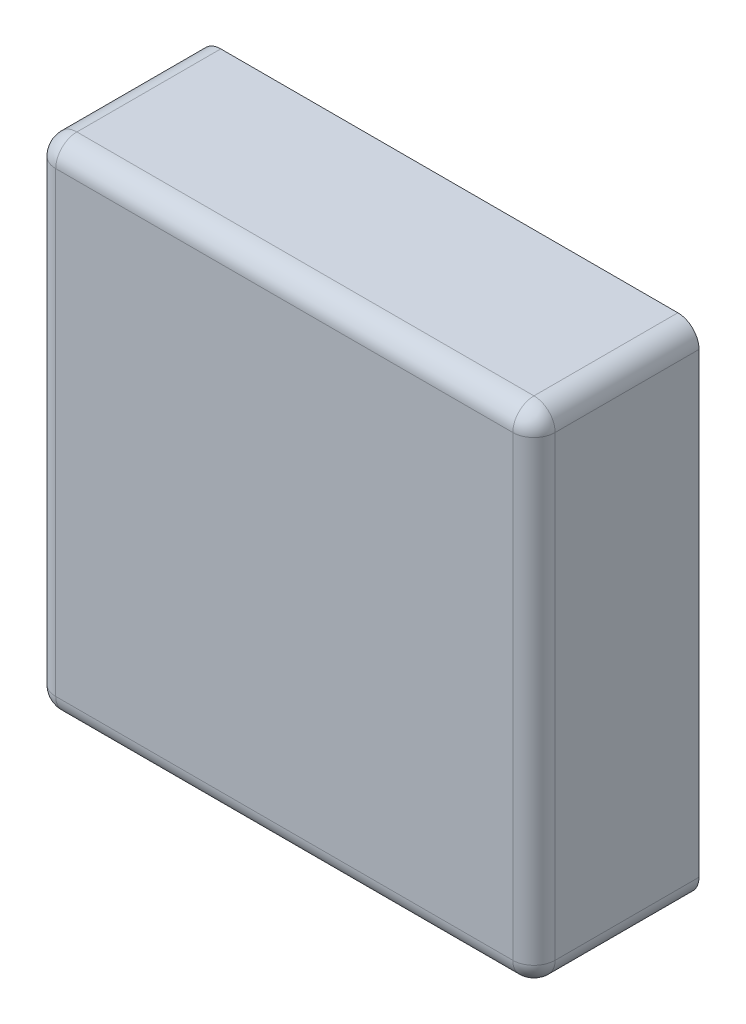
ISO-10303-21;
HEADER;
FILE_DESCRIPTION(('STEP AP214'),'2;1');
FILE_NAME('part.step','',(''),(''),'','','');
FILE_SCHEMA(('AUTOMOTIVE_DESIGN { 1 0 10303 214 1 1 1 1 }'));
ENDSEC;
DATA;
#1=APPLICATION_CONTEXT('core data for automotive mechanical design processes');
#2=APPLICATION_PROTOCOL_DEFINITION('international standard','automotive_design',2000,#1);
#3=PRODUCT_CONTEXT('',#1,'mechanical');
#4=PRODUCT('Part','Part','',(#3));
#5=PRODUCT_RELATED_PRODUCT_CATEGORY('part','',(#4));
#6=PRODUCT_DEFINITION_FORMATION('','',#4);
#7=PRODUCT_DEFINITION_CONTEXT('part definition',#1,'design');
#8=PRODUCT_DEFINITION('design','',#6,#7);
#9=PRODUCT_DEFINITION_SHAPE('','',#8);
#10=(LENGTH_UNIT() NAMED_UNIT(*) SI_UNIT(.MILLI.,.METRE.));
#11=(NAMED_UNIT(*) PLANE_ANGLE_UNIT() SI_UNIT($,.RADIAN.));
#12=(NAMED_UNIT(*) SI_UNIT($,.STERADIAN.) SOLID_ANGLE_UNIT());
#13=UNCERTAINTY_MEASURE_WITH_UNIT(LENGTH_MEASURE(1.E-05),#10,'distance_accuracy_value','');
#14=(GEOMETRIC_REPRESENTATION_CONTEXT(3) GLOBAL_UNCERTAINTY_ASSIGNED_CONTEXT((#13)) GLOBAL_UNIT_ASSIGNED_CONTEXT((#10,
#11,#12)) REPRESENTATION_CONTEXT('',''));
#15=CARTESIAN_POINT('',(0.,0.,0.));
#16=DIRECTION('',(0.,0.,1.));
#17=DIRECTION('',(1.,0.,0.));
#18=AXIS2_PLACEMENT_3D('',#15,#16,#17);
#19=CARTESIAN_POINT('',(5.9,-5.9,3.2));
#20=DIRECTION('',(0.,0.,1.));
#21=DIRECTION('',(1.,0.,0.));
#22=AXIS2_PLACEMENT_3D('',#19,#20,#21);
#23=PLANE('',#22);
#24=DIRECTION('',(0.,1.,0.));
#25=VECTOR('',#24,1.);
#26=CARTESIAN_POINT('',(10.9,-10.9,3.2));
#27=LINE('',#26,#25);
#28=CARTESIAN_POINT('',(10.9,-0.9,3.2));
#29=VERTEX_POINT('',#28);
#30=CARTESIAN_POINT('',(10.9,-10.9,3.2));
#31=VERTEX_POINT('',#30);
#32=EDGE_CURVE('E138',#29,#31,#27,.F.);
#33=ORIENTED_EDGE('',*,*,#32,.T.);
#34=DIRECTION('',(1.,0.,0.));
#35=VECTOR('',#34,1.);
#36=CARTESIAN_POINT('',(0.900000000000001,-10.9,3.2));
#37=LINE('',#36,#35);
#38=CARTESIAN_POINT('',(0.9,-10.9,3.2));
#39=VERTEX_POINT('',#38);
#40=EDGE_CURVE('E135',#31,#39,#37,.F.);
#41=ORIENTED_EDGE('',*,*,#40,.T.);
#42=DIRECTION('',(0.,1.,0.));
#43=VECTOR('',#42,1.);
#44=CARTESIAN_POINT('',(0.9,-0.900000000000001,3.2));
#45=LINE('',#44,#43);
#46=CARTESIAN_POINT('',(0.9,-0.9,3.2));
#47=VERTEX_POINT('',#46);
#48=EDGE_CURVE('E132',#39,#47,#45,.T.);
#49=ORIENTED_EDGE('',*,*,#48,.T.);
#50=DIRECTION('',(1.,0.,0.));
#51=VECTOR('',#50,1.);
#52=CARTESIAN_POINT('',(10.9,-0.9,3.2));
#53=LINE('',#52,#51);
#54=EDGE_CURVE('E155',#47,#29,#53,.T.);
#55=ORIENTED_EDGE('',*,*,#54,.T.);
#56=EDGE_LOOP('',(#33,#41,#49,#55));
#57=FACE_BOUND('',#56,.T.);
#58=ADVANCED_FACE('F17',(#57),#23,.F.);
#59=CARTESIAN_POINT('',(0.900000000000001,-10.9,0.));
#60=DIRECTION('',(0.,-1.,0.));
#61=DIRECTION('',(0.,0.,-1.));
#62=AXIS2_PLACEMENT_3D('',#59,#60,#61);
#63=PLANE('',#62);
#64=DIRECTION('',(0.,0.,1.));
#65=VECTOR('',#64,1.);
#66=CARTESIAN_POINT('',(0.9,-10.9,0.));
#67=LINE('',#66,#65);
#68=CARTESIAN_POINT('',(0.9,-10.9,0.));
#69=VERTEX_POINT('',#68);
#70=EDGE_CURVE('E141',#69,#39,#67,.T.);
#71=ORIENTED_EDGE('',*,*,#70,.T.);
#72=ORIENTED_EDGE('',*,*,#40,.F.);
#73=DIRECTION('',(0.,0.,-1.));
#74=VECTOR('',#73,1.);
#75=CARTESIAN_POINT('',(10.9,-10.9,0.));
#76=LINE('',#75,#74);
#77=CARTESIAN_POINT('',(10.9,-10.9,0.));
#78=VERTEX_POINT('',#77);
#79=EDGE_CURVE('E211',#31,#78,#76,.T.);
#80=ORIENTED_EDGE('',*,*,#79,.T.);
#81=DIRECTION('',(1.,0.,0.));
#82=VECTOR('',#81,1.);
#83=CARTESIAN_POINT('',(5.9,-10.9,0.));
#84=LINE('',#83,#82);
#85=EDGE_CURVE('E146',#78,#69,#84,.F.);
#86=ORIENTED_EDGE('',*,*,#85,.T.);
#87=EDGE_LOOP('',(#71,#72,#80,#86));
#88=FACE_BOUND('',#87,.T.);
#89=ADVANCED_FACE('F144',(#88),#63,.F.);
#90=CARTESIAN_POINT('',(0.9,-0.900000000000001,0.));
#91=DIRECTION('',(-1.,0.,0.));
#92=DIRECTION('',(0.,0.,1.));
#93=AXIS2_PLACEMENT_3D('',#90,#91,#92);
#94=PLANE('',#93);
#95=DIRECTION('',(0.,0.,1.));
#96=VECTOR('',#95,1.);
#97=CARTESIAN_POINT('',(0.9,-0.9,0.));
#98=LINE('',#97,#96);
#99=CARTESIAN_POINT('',(0.9,-0.9,0.));
#100=VERTEX_POINT('',#99);
#101=EDGE_CURVE('E152',#100,#47,#98,.T.);
#102=ORIENTED_EDGE('',*,*,#101,.T.);
#103=ORIENTED_EDGE('',*,*,#48,.F.);
#104=ORIENTED_EDGE('',*,*,#70,.F.);
#105=DIRECTION('',(0.,1.,0.));
#106=VECTOR('',#105,1.);
#107=CARTESIAN_POINT('',(0.9,-5.9,0.));
#108=LINE('',#107,#106);
#109=EDGE_CURVE('E233',#69,#100,#108,.T.);
#110=ORIENTED_EDGE('',*,*,#109,.T.);
#111=EDGE_LOOP('',(#102,#103,#104,#110));
#112=FACE_BOUND('',#111,.T.);
#113=ADVANCED_FACE('F150',(#112),#94,.F.);
#114=CARTESIAN_POINT('',(10.9,-0.9,0.));
#115=DIRECTION('',(0.,1.,0.));
#116=DIRECTION('',(0.,0.,1.));
#117=AXIS2_PLACEMENT_3D('',#114,#115,#116);
#118=PLANE('',#117);
#119=DIRECTION('',(0.,0.,-1.));
#120=VECTOR('',#119,1.);
#121=CARTESIAN_POINT('',(10.9,-0.9,0.));
#122=LINE('',#121,#120);
#123=CARTESIAN_POINT('',(10.9,-0.9,0.));
#124=VERTEX_POINT('',#123);
#125=EDGE_CURVE('E215',#124,#29,#122,.F.);
#126=ORIENTED_EDGE('',*,*,#125,.T.);
#127=ORIENTED_EDGE('',*,*,#54,.F.);
#128=ORIENTED_EDGE('',*,*,#101,.F.);
#129=DIRECTION('',(1.,0.,0.));
#130=VECTOR('',#129,1.);
#131=CARTESIAN_POINT('',(5.9,-0.9,0.));
#132=LINE('',#131,#130);
#133=EDGE_CURVE('E226',#100,#124,#132,.T.);
#134=ORIENTED_EDGE('',*,*,#133,.T.);
#135=EDGE_LOOP('',(#126,#127,#128,#134));
#136=FACE_BOUND('',#135,.T.);
#137=ADVANCED_FACE('F224',(#136),#118,.F.);
#138=CARTESIAN_POINT('',(10.9,-10.9,0.));
#139=DIRECTION('',(1.,0.,0.));
#140=DIRECTION('',(0.,0.,-1.));
#141=AXIS2_PLACEMENT_3D('',#138,#139,#140);
#142=PLANE('',#141);
#143=ORIENTED_EDGE('',*,*,#79,.F.);
#144=ORIENTED_EDGE('',*,*,#32,.F.);
#145=ORIENTED_EDGE('',*,*,#125,.F.);
#146=DIRECTION('',(0.,1.,0.));
#147=VECTOR('',#146,1.);
#148=CARTESIAN_POINT('',(10.9,-5.9,0.));
#149=LINE('',#148,#147);
#150=EDGE_CURVE('E205',#124,#78,#149,.F.);
#151=ORIENTED_EDGE('',*,*,#150,.T.);
#152=EDGE_LOOP('',(#143,#144,#145,#151));
#153=FACE_BOUND('',#152,.T.);
#154=ADVANCED_FACE('F229',(#153),#142,.F.);
#155=CARTESIAN_POINT('',(11.3,-11.3,0.));
#156=DIRECTION('',(0.,0.,1.));
#157=DIRECTION('',(1.,0.,0.));
#158=AXIS2_PLACEMENT_3D('',#155,#156,#157);
#159=CYLINDRICAL_SURFACE('',#158,0.5);
#160=CARTESIAN_POINT('',(11.3,-11.3,0.));
#161=DIRECTION('',(0.,0.,1.));
#162=DIRECTION('',(1.,0.,0.));
#163=AXIS2_PLACEMENT_3D('',#160,#161,#162);
#164=CIRCLE('',#163,0.5);
#165=CARTESIAN_POINT('',(11.3,-11.8,0.));
#166=VERTEX_POINT('',#165);
#167=CARTESIAN_POINT('',(11.8,-11.3,0.));
#168=VERTEX_POINT('',#167);
#169=EDGE_CURVE('E207',#166,#168,#164,.T.);
#170=ORIENTED_EDGE('',*,*,#169,.T.);
#171=DIRECTION('',(0.,0.,-1.));
#172=VECTOR('',#171,1.);
#173=CARTESIAN_POINT('',(11.8,-11.3,0.));
#174=LINE('',#173,#172);
#175=CARTESIAN_POINT('',(11.8,-11.3,3.4));
#176=VERTEX_POINT('',#175);
#177=EDGE_CURVE('E198',#176,#168,#174,.T.);
#178=ORIENTED_EDGE('',*,*,#177,.F.);
#179=CARTESIAN_POINT('',(11.3,-11.3,3.4));
#180=DIRECTION('',(0.,0.,1.));
#181=DIRECTION('',(1.,0.,0.));
#182=AXIS2_PLACEMENT_3D('',#179,#180,#181);
#183=CIRCLE('',#182,0.5);
#184=CARTESIAN_POINT('',(11.3,-11.8,3.4));
#185=VERTEX_POINT('',#184);
#186=EDGE_CURVE('E195',#185,#176,#183,.T.);
#187=ORIENTED_EDGE('',*,*,#186,.F.);
#188=DIRECTION('',(0.,0.,-1.));
#189=VECTOR('',#188,1.);
#190=CARTESIAN_POINT('',(11.3,-11.8,0.));
#191=LINE('',#190,#189);
#192=EDGE_CURVE('E199',#166,#185,#191,.F.);
#193=ORIENTED_EDGE('',*,*,#192,.F.);
#194=EDGE_LOOP('',(#170,#178,#187,#193));
#195=FACE_BOUND('',#194,.T.);
#196=ADVANCED_FACE('F277',(#195),#159,.T.);
#197=CARTESIAN_POINT('',(11.3,-0.5,0.));
#198=DIRECTION('',(0.,0.,1.));
#199=DIRECTION('',(1.,0.,0.));
#200=AXIS2_PLACEMENT_3D('',#197,#198,#199);
#201=CYLINDRICAL_SURFACE('',#200,0.5);
#202=CARTESIAN_POINT('',(11.3,-0.5,0.));
#203=DIRECTION('',(0.,0.,1.));
#204=DIRECTION('',(1.,0.,0.));
#205=AXIS2_PLACEMENT_3D('',#202,#203,#204);
#206=CIRCLE('',#205,0.5);
#207=CARTESIAN_POINT('',(11.8,-0.5,0.));
#208=VERTEX_POINT('',#207);
#209=CARTESIAN_POINT('',(11.3,0.,0.));
#210=VERTEX_POINT('',#209);
#211=EDGE_CURVE('E206',#208,#210,#206,.T.);
#212=ORIENTED_EDGE('',*,*,#211,.T.);
#213=DIRECTION('',(0.,0.,1.));
#214=VECTOR('',#213,1.);
#215=CARTESIAN_POINT('',(11.3,0.,0.));
#216=LINE('',#215,#214);
#217=CARTESIAN_POINT('',(11.3,0.,3.4));
#218=VERTEX_POINT('',#217);
#219=EDGE_CURVE('E193',#218,#210,#216,.F.);
#220=ORIENTED_EDGE('',*,*,#219,.F.);
#221=CARTESIAN_POINT('',(11.3,-0.5,3.4));
#222=DIRECTION('',(0.,0.,1.));
#223=DIRECTION('',(1.,0.,0.));
#224=AXIS2_PLACEMENT_3D('',#221,#222,#223);
#225=CIRCLE('',#224,0.5);
#226=CARTESIAN_POINT('',(11.8,-0.5,3.4));
#227=VERTEX_POINT('',#226);
#228=EDGE_CURVE('E190',#227,#218,#225,.T.);
#229=ORIENTED_EDGE('',*,*,#228,.F.);
#230=DIRECTION('',(0.,0.,-1.));
#231=VECTOR('',#230,1.);
#232=CARTESIAN_POINT('',(11.8,-0.5,0.));
#233=LINE('',#232,#231);
#234=EDGE_CURVE('E194',#208,#227,#233,.F.);
#235=ORIENTED_EDGE('',*,*,#234,.F.);
#236=EDGE_LOOP('',(#212,#220,#229,#235));
#237=FACE_BOUND('',#236,.T.);
#238=ADVANCED_FACE('F274',(#237),#201,.T.);
#239=CARTESIAN_POINT('',(0.5,-0.5,0.));
#240=DIRECTION('',(0.,0.,1.));
#241=DIRECTION('',(1.,0.,0.));
#242=AXIS2_PLACEMENT_3D('',#239,#240,#241);
#243=CYLINDRICAL_SURFACE('',#242,0.5);
#244=CARTESIAN_POINT('',(0.5,-0.5,0.));
#245=DIRECTION('',(0.,0.,1.));
#246=DIRECTION('',(1.,0.,0.));
#247=AXIS2_PLACEMENT_3D('',#244,#245,#246);
#248=CIRCLE('',#247,0.5);
#249=CARTESIAN_POINT('',(0.5,0.,0.));
#250=VERTEX_POINT('',#249);
#251=CARTESIAN_POINT('',(0.,-0.5,0.));
#252=VERTEX_POINT('',#251);
#253=EDGE_CURVE('E20',#250,#252,#248,.T.);
#254=ORIENTED_EDGE('',*,*,#253,.T.);
#255=DIRECTION('',(0.,0.,1.));
#256=VECTOR('',#255,1.);
#257=CARTESIAN_POINT('',(0.,-0.5,0.));
#258=LINE('',#257,#256);
#259=CARTESIAN_POINT('',(0.,-0.5,3.4));
#260=VERTEX_POINT('',#259);
#261=EDGE_CURVE('E188',#260,#252,#258,.F.);
#262=ORIENTED_EDGE('',*,*,#261,.F.);
#263=CARTESIAN_POINT('',(0.5,-0.5,3.4));
#264=DIRECTION('',(0.,0.,1.));
#265=DIRECTION('',(1.,0.,0.));
#266=AXIS2_PLACEMENT_3D('',#263,#264,#265);
#267=CIRCLE('',#266,0.5);
#268=CARTESIAN_POINT('',(0.5,0.,3.4));
#269=VERTEX_POINT('',#268);
#270=EDGE_CURVE('E186',#269,#260,#267,.T.);
#271=ORIENTED_EDGE('',*,*,#270,.F.);
#272=DIRECTION('',(0.,0.,1.));
#273=VECTOR('',#272,1.);
#274=CARTESIAN_POINT('',(0.5,0.,0.));
#275=LINE('',#274,#273);
#276=EDGE_CURVE('E189',#250,#269,#275,.T.);
#277=ORIENTED_EDGE('',*,*,#276,.F.);
#278=EDGE_LOOP('',(#254,#262,#271,#277));
#279=FACE_BOUND('',#278,.T.);
#280=ADVANCED_FACE('F271',(#279),#243,.T.);
#281=CARTESIAN_POINT('',(5.9,-5.9,0.));
#282=DIRECTION('',(0.,0.,1.));
#283=DIRECTION('',(1.,0.,0.));
#284=AXIS2_PLACEMENT_3D('',#281,#282,#283);
#285=PLANE('',#284);
#286=ORIENTED_EDGE('',*,*,#133,.F.);
#287=ORIENTED_EDGE('',*,*,#109,.F.);
#288=ORIENTED_EDGE('',*,*,#85,.F.);
#289=ORIENTED_EDGE('',*,*,#150,.F.);
#290=EDGE_LOOP('',(#286,#287,#288,#289));
#291=FACE_BOUND('',#290,.T.);
#292=DIRECTION('',(0.,1.,0.));
#293=VECTOR('',#292,1.);
#294=CARTESIAN_POINT('',(11.8,-11.8,0.));
#295=LINE('',#294,#293);
#296=EDGE_CURVE('E240',#168,#208,#295,.T.);
#297=ORIENTED_EDGE('',*,*,#296,.F.);
#298=ORIENTED_EDGE('',*,*,#169,.F.);
#299=DIRECTION('',(1.,0.,0.));
#300=VECTOR('',#299,1.);
#301=CARTESIAN_POINT('',(0.,-11.8,0.));
#302=LINE('',#301,#300);
#303=CARTESIAN_POINT('',(0.5,-11.8,0.));
#304=VERTEX_POINT('',#303);
#305=EDGE_CURVE('E218',#304,#166,#302,.T.);
#306=ORIENTED_EDGE('',*,*,#305,.F.);
#307=CARTESIAN_POINT('',(0.5,-11.3,0.));
#308=DIRECTION('',(0.,0.,1.));
#309=DIRECTION('',(1.,0.,0.));
#310=AXIS2_PLACEMENT_3D('',#307,#308,#309);
#311=CIRCLE('',#310,0.5);
#312=CARTESIAN_POINT('',(0.,-11.3,0.));
#313=VERTEX_POINT('',#312);
#314=EDGE_CURVE('E200',#313,#304,#311,.T.);
#315=ORIENTED_EDGE('',*,*,#314,.F.);
#316=DIRECTION('',(0.,1.,0.));
#317=VECTOR('',#316,1.);
#318=CARTESIAN_POINT('',(0.,0.,0.));
#319=LINE('',#318,#317);
#320=EDGE_CURVE('E331',#252,#313,#319,.F.);
#321=ORIENTED_EDGE('',*,*,#320,.F.);
#322=ORIENTED_EDGE('',*,*,#253,.F.);
#323=DIRECTION('',(1.,0.,0.));
#324=VECTOR('',#323,1.);
#325=CARTESIAN_POINT('',(11.8,0.,0.));
#326=LINE('',#325,#324);
#327=EDGE_CURVE('E238',#210,#250,#326,.F.);
#328=ORIENTED_EDGE('',*,*,#327,.F.);
#329=ORIENTED_EDGE('',*,*,#211,.F.);
#330=EDGE_LOOP('',(#297,#298,#306,#315,#321,#322,#328,#329));
#331=FACE_BOUND('',#330,.T.);
#332=ADVANCED_FACE('F232',(#291,#331),#285,.F.);
#333=CARTESIAN_POINT('',(0.5,-11.3,0.));
#334=DIRECTION('',(0.,0.,1.));
#335=DIRECTION('',(1.,0.,0.));
#336=AXIS2_PLACEMENT_3D('',#333,#334,#335);
#337=CYLINDRICAL_SURFACE('',#336,0.5);
#338=ORIENTED_EDGE('',*,*,#314,.T.);
#339=DIRECTION('',(0.,0.,-1.));
#340=VECTOR('',#339,1.);
#341=CARTESIAN_POINT('',(0.5,-11.8,0.));
#342=LINE('',#341,#340);
#343=CARTESIAN_POINT('',(0.5,-11.8,3.4));
#344=VERTEX_POINT('',#343);
#345=EDGE_CURVE('E202',#344,#304,#342,.T.);
#346=ORIENTED_EDGE('',*,*,#345,.F.);
#347=CARTESIAN_POINT('',(0.5,-11.3,3.4));
#348=DIRECTION('',(0.,0.,1.));
#349=DIRECTION('',(1.,0.,0.));
#350=AXIS2_PLACEMENT_3D('',#347,#348,#349);
#351=CIRCLE('',#350,0.5);
#352=CARTESIAN_POINT('',(0.,-11.3,3.4));
#353=VERTEX_POINT('',#352);
#354=EDGE_CURVE('E203',#344,#353,#351,.F.);
#355=ORIENTED_EDGE('',*,*,#354,.T.);
#356=DIRECTION('',(0.,0.,1.));
#357=VECTOR('',#356,1.);
#358=CARTESIAN_POINT('',(0.,-11.3,0.));
#359=LINE('',#358,#357);
#360=EDGE_CURVE('E185',#313,#353,#359,.T.);
#361=ORIENTED_EDGE('',*,*,#360,.F.);
#362=EDGE_LOOP('',(#338,#346,#355,#361));
#363=FACE_BOUND('',#362,.T.);
#364=ADVANCED_FACE('F264',(#363),#337,.T.);
#365=CARTESIAN_POINT('',(0.,-11.8,0.));
#366=DIRECTION('',(0.,-1.,0.));
#367=DIRECTION('',(0.,0.,-1.));
#368=AXIS2_PLACEMENT_3D('',#365,#366,#367);
#369=PLANE('',#368);
#370=ORIENTED_EDGE('',*,*,#305,.T.);
#371=ORIENTED_EDGE('',*,*,#192,.T.);
#372=DIRECTION('',(1.,0.,0.));
#373=VECTOR('',#372,1.);
#374=CARTESIAN_POINT('',(2.95,-11.8,3.4));
#375=LINE('',#374,#373);
#376=EDGE_CURVE('E181',#344,#185,#375,.T.);
#377=ORIENTED_EDGE('',*,*,#376,.F.);
#378=ORIENTED_EDGE('',*,*,#345,.T.);
#379=EDGE_LOOP('',(#370,#371,#377,#378));
#380=FACE_BOUND('',#379,.T.);
#381=ADVANCED_FACE('F259',(#380),#369,.T.);
#382=CARTESIAN_POINT('',(11.3,-11.3,3.4));
#383=DIRECTION('',(0.577350269189628,-0.577350269189624,0.577350269189626));
#384=DIRECTION('',(-0.707106781186546,-0.707106781186549,0.));
#385=AXIS2_PLACEMENT_3D('',#382,#383,#384);
#386=SPHERICAL_SURFACE('',#385,0.5);
#387=CARTESIAN_POINT('',(11.5886751345948,-11.5886751345948,3.68867513459481));
#388=VERTEX_POINT('',#387);
#389=VERTEX_LOOP('',#388);
#390=FACE_BOUND('',#389,.T.);
#391=ORIENTED_EDGE('',*,*,#186,.T.);
#392=CARTESIAN_POINT('',(11.3,-11.3,3.4));
#393=DIRECTION('',(0.,1.,0.));
#394=DIRECTION('',(0.,0.,1.));
#395=AXIS2_PLACEMENT_3D('',#392,#393,#394);
#396=CIRCLE('',#395,0.5);
#397=CARTESIAN_POINT('',(11.3,-11.3,3.9));
#398=VERTEX_POINT('',#397);
#399=EDGE_CURVE('E175',#398,#176,#396,.T.);
#400=ORIENTED_EDGE('',*,*,#399,.F.);
#401=CARTESIAN_POINT('',(11.3,-11.3,3.4));
#402=DIRECTION('',(1.,0.,0.));
#403=DIRECTION('',(0.,0.,-1.));
#404=AXIS2_PLACEMENT_3D('',#401,#402,#403);
#405=CIRCLE('',#404,0.5);
#406=EDGE_CURVE('E178',#185,#398,#405,.F.);
#407=ORIENTED_EDGE('',*,*,#406,.F.);
#408=EDGE_LOOP('',(#391,#400,#407));
#409=FACE_BOUND('',#408,.T.);
#410=ADVANCED_FACE('F254',(#390,#409),#386,.T.);
#411=CARTESIAN_POINT('',(11.8,-11.8,0.));
#412=DIRECTION('',(1.,0.,0.));
#413=DIRECTION('',(0.,0.,-1.));
#414=AXIS2_PLACEMENT_3D('',#411,#412,#413);
#415=PLANE('',#414);
#416=ORIENTED_EDGE('',*,*,#296,.T.);
#417=ORIENTED_EDGE('',*,*,#234,.T.);
#418=DIRECTION('',(0.,1.,0.));
#419=VECTOR('',#418,1.);
#420=CARTESIAN_POINT('',(11.8,-8.85,3.4));
#421=LINE('',#420,#419);
#422=EDGE_CURVE('E174',#176,#227,#421,.T.);
#423=ORIENTED_EDGE('',*,*,#422,.F.);
#424=ORIENTED_EDGE('',*,*,#177,.T.);
#425=EDGE_LOOP('',(#416,#417,#423,#424));
#426=FACE_BOUND('',#425,.T.);
#427=ADVANCED_FACE('F258',(#426),#415,.T.);
#428=CARTESIAN_POINT('',(11.3,-0.5,3.4));
#429=DIRECTION('',(0.577350269189625,0.577350269189627,0.577350269189626));
#430=DIRECTION('',(0.,0.707106781186547,-0.707106781186548));
#431=AXIS2_PLACEMENT_3D('',#428,#429,#430);
#432=SPHERICAL_SURFACE('',#431,0.5);
#433=CARTESIAN_POINT('',(11.5886751345948,-0.211324865405187,3.68867513459481));
#434=VERTEX_POINT('',#433);
#435=VERTEX_LOOP('',#434);
#436=FACE_BOUND('',#435,.T.);
#437=ORIENTED_EDGE('',*,*,#228,.T.);
#438=CARTESIAN_POINT('',(11.3,-0.5,3.4));
#439=DIRECTION('',(-1.,0.,0.));
#440=DIRECTION('',(0.,0.,1.));
#441=AXIS2_PLACEMENT_3D('',#438,#439,#440);
#442=CIRCLE('',#441,0.5);
#443=CARTESIAN_POINT('',(11.3,-0.5,3.9));
#444=VERTEX_POINT('',#443);
#445=EDGE_CURVE('E168',#444,#218,#442,.T.);
#446=ORIENTED_EDGE('',*,*,#445,.F.);
#447=CARTESIAN_POINT('',(11.3,-0.5,3.4));
#448=DIRECTION('',(0.,1.,0.));
#449=DIRECTION('',(0.,0.,1.));
#450=AXIS2_PLACEMENT_3D('',#447,#448,#449);
#451=CIRCLE('',#450,0.5);
#452=EDGE_CURVE('E171',#227,#444,#451,.F.);
#453=ORIENTED_EDGE('',*,*,#452,.F.);
#454=EDGE_LOOP('',(#437,#446,#453));
#455=FACE_BOUND('',#454,.T.);
#456=ADVANCED_FACE('F342',(#436,#455),#432,.T.);
#457=CARTESIAN_POINT('',(11.8,0.,0.));
#458=DIRECTION('',(0.,1.,0.));
#459=DIRECTION('',(0.,0.,1.));
#460=AXIS2_PLACEMENT_3D('',#457,#458,#459);
#461=PLANE('',#460);
#462=ORIENTED_EDGE('',*,*,#327,.T.);
#463=ORIENTED_EDGE('',*,*,#276,.T.);
#464=DIRECTION('',(-1.,0.,0.));
#465=VECTOR('',#464,1.);
#466=CARTESIAN_POINT('',(8.85,0.,3.4));
#467=LINE('',#466,#465);
#468=EDGE_CURVE('E167',#218,#269,#467,.T.);
#469=ORIENTED_EDGE('',*,*,#468,.F.);
#470=ORIENTED_EDGE('',*,*,#219,.T.);
#471=EDGE_LOOP('',(#462,#463,#469,#470));
#472=FACE_BOUND('',#471,.T.);
#473=ADVANCED_FACE('F340',(#472),#461,.T.);
#474=CARTESIAN_POINT('',(0.5,-0.5,3.4));
#475=DIRECTION('',(-0.577350269189627,0.577350269189626,0.577350269189625));
#476=DIRECTION('',(0.707106781186547,0.707106781186548,0.));
#477=AXIS2_PLACEMENT_3D('',#474,#475,#476);
#478=SPHERICAL_SURFACE('',#477,0.5);
#479=CARTESIAN_POINT('',(0.211324865405187,-0.211324865405187,3.68867513459481));
#480=VERTEX_POINT('',#479);
#481=VERTEX_LOOP('',#480);
#482=FACE_BOUND('',#481,.T.);
#483=ORIENTED_EDGE('',*,*,#270,.T.);
#484=CARTESIAN_POINT('',(0.5,-0.5,3.4));
#485=DIRECTION('',(0.,-1.,0.));
#486=DIRECTION('',(0.,0.,-1.));
#487=AXIS2_PLACEMENT_3D('',#484,#485,#486);
#488=CIRCLE('',#487,0.5);
#489=CARTESIAN_POINT('',(0.5,-0.5,3.9));
#490=VERTEX_POINT('',#489);
#491=EDGE_CURVE('E35',#490,#260,#488,.T.);
#492=ORIENTED_EDGE('',*,*,#491,.F.);
#493=CARTESIAN_POINT('',(0.5,-0.5,3.4));
#494=DIRECTION('',(-1.,0.,0.));
#495=DIRECTION('',(0.,0.,1.));
#496=AXIS2_PLACEMENT_3D('',#493,#494,#495);
#497=CIRCLE('',#496,0.5);
#498=EDGE_CURVE('E165',#269,#490,#497,.F.);
#499=ORIENTED_EDGE('',*,*,#498,.F.);
#500=EDGE_LOOP('',(#483,#492,#499));
#501=FACE_BOUND('',#500,.T.);
#502=ADVANCED_FACE('F337',(#482,#501),#478,.T.);
#503=CARTESIAN_POINT('',(0.,0.,0.));
#504=DIRECTION('',(-1.,0.,0.));
#505=DIRECTION('',(0.,0.,1.));
#506=AXIS2_PLACEMENT_3D('',#503,#504,#505);
#507=PLANE('',#506);
#508=ORIENTED_EDGE('',*,*,#320,.T.);
#509=ORIENTED_EDGE('',*,*,#360,.T.);
#510=DIRECTION('',(0.,-1.,0.));
#511=VECTOR('',#510,1.);
#512=CARTESIAN_POINT('',(0.,-2.95,3.4));
#513=LINE('',#512,#511);
#514=EDGE_CURVE('E163',#260,#353,#513,.T.);
#515=ORIENTED_EDGE('',*,*,#514,.F.);
#516=ORIENTED_EDGE('',*,*,#261,.T.);
#517=EDGE_LOOP('',(#508,#509,#515,#516));
#518=FACE_BOUND('',#517,.T.);
#519=ADVANCED_FACE('F319',(#518),#507,.T.);
#520=CARTESIAN_POINT('',(0.5,-11.3,3.4));
#521=DIRECTION('',(-0.577350269189626,-0.577350269189626,0.577350269189625));
#522=DIRECTION('',(0.,0.707106781186547,0.707106781186548));
#523=AXIS2_PLACEMENT_3D('',#520,#521,#522);
#524=SPHERICAL_SURFACE('',#523,0.5);
#525=CARTESIAN_POINT('',(0.211324865405187,-11.5886751345948,3.68867513459481));
#526=VERTEX_POINT('',#525);
#527=VERTEX_LOOP('',#526);
#528=FACE_BOUND('',#527,.T.);
#529=ORIENTED_EDGE('',*,*,#354,.F.);
#530=CARTESIAN_POINT('',(0.5,-11.3,3.4));
#531=DIRECTION('',(1.,0.,0.));
#532=DIRECTION('',(0.,0.,-1.));
#533=AXIS2_PLACEMENT_3D('',#530,#531,#532);
#534=CIRCLE('',#533,0.5);
#535=CARTESIAN_POINT('',(0.5,-11.3,3.9));
#536=VERTEX_POINT('',#535);
#537=EDGE_CURVE('E182',#536,#344,#534,.T.);
#538=ORIENTED_EDGE('',*,*,#537,.F.);
#539=CARTESIAN_POINT('',(0.5,-11.3,3.4));
#540=DIRECTION('',(0.,-1.,0.));
#541=DIRECTION('',(0.,0.,-1.));
#542=AXIS2_PLACEMENT_3D('',#539,#540,#541);
#543=CIRCLE('',#542,0.5);
#544=EDGE_CURVE('E159',#353,#536,#543,.F.);
#545=ORIENTED_EDGE('',*,*,#544,.F.);
#546=EDGE_LOOP('',(#529,#538,#545));
#547=FACE_BOUND('',#546,.T.);
#548=ADVANCED_FACE('F314',(#528,#547),#524,.T.);
#549=CARTESIAN_POINT('',(2.95,-11.3,3.4));
#550=DIRECTION('',(1.,0.,0.));
#551=DIRECTION('',(0.,0.,-1.));
#552=AXIS2_PLACEMENT_3D('',#549,#550,#551);
#553=CYLINDRICAL_SURFACE('',#552,0.5);
#554=ORIENTED_EDGE('',*,*,#406,.T.);
#555=DIRECTION('',(1.,0.,0.));
#556=VECTOR('',#555,1.);
#557=CARTESIAN_POINT('',(5.9,-11.3,3.9));
#558=LINE('',#557,#556);
#559=EDGE_CURVE('E162',#536,#398,#558,.T.);
#560=ORIENTED_EDGE('',*,*,#559,.F.);
#561=ORIENTED_EDGE('',*,*,#537,.T.);
#562=ORIENTED_EDGE('',*,*,#376,.T.);
#563=EDGE_LOOP('',(#554,#560,#561,#562));
#564=FACE_BOUND('',#563,.T.);
#565=ADVANCED_FACE('F310',(#564),#553,.T.);
#566=CARTESIAN_POINT('',(11.3,-8.85,3.4));
#567=DIRECTION('',(0.,1.,0.));
#568=DIRECTION('',(0.,0.,1.));
#569=AXIS2_PLACEMENT_3D('',#566,#567,#568);
#570=CYLINDRICAL_SURFACE('',#569,0.5);
#571=ORIENTED_EDGE('',*,*,#452,.T.);
#572=DIRECTION('',(0.,1.,0.));
#573=VECTOR('',#572,1.);
#574=CARTESIAN_POINT('',(11.3,-5.9,3.9));
#575=LINE('',#574,#573);
#576=EDGE_CURVE('E327',#398,#444,#575,.T.);
#577=ORIENTED_EDGE('',*,*,#576,.F.);
#578=ORIENTED_EDGE('',*,*,#399,.T.);
#579=ORIENTED_EDGE('',*,*,#422,.T.);
#580=EDGE_LOOP('',(#571,#577,#578,#579));
#581=FACE_BOUND('',#580,.T.);
#582=ADVANCED_FACE('F306',(#581),#570,.T.);
#583=CARTESIAN_POINT('',(8.85,-0.5,3.4));
#584=DIRECTION('',(-1.,0.,0.));
#585=DIRECTION('',(0.,0.,1.));
#586=AXIS2_PLACEMENT_3D('',#583,#584,#585);
#587=CYLINDRICAL_SURFACE('',#586,0.5);
#588=ORIENTED_EDGE('',*,*,#498,.T.);
#589=DIRECTION('',(1.,0.,0.));
#590=VECTOR('',#589,1.);
#591=CARTESIAN_POINT('',(5.9,-0.5,3.9));
#592=LINE('',#591,#590);
#593=EDGE_CURVE('E26',#444,#490,#592,.F.);
#594=ORIENTED_EDGE('',*,*,#593,.F.);
#595=ORIENTED_EDGE('',*,*,#445,.T.);
#596=ORIENTED_EDGE('',*,*,#468,.T.);
#597=EDGE_LOOP('',(#588,#594,#595,#596));
#598=FACE_BOUND('',#597,.T.);
#599=ADVANCED_FACE('F299',(#598),#587,.T.);
#600=CARTESIAN_POINT('',(0.5,-2.95,3.4));
#601=DIRECTION('',(0.,-1.,0.));
#602=DIRECTION('',(0.,0.,-1.));
#603=AXIS2_PLACEMENT_3D('',#600,#601,#602);
#604=CYLINDRICAL_SURFACE('',#603,0.5);
#605=ORIENTED_EDGE('',*,*,#544,.T.);
#606=DIRECTION('',(0.,1.,0.));
#607=VECTOR('',#606,1.);
#608=CARTESIAN_POINT('',(0.5,-5.9,3.9));
#609=LINE('',#608,#607);
#610=EDGE_CURVE('E11',#490,#536,#609,.F.);
#611=ORIENTED_EDGE('',*,*,#610,.F.);
#612=ORIENTED_EDGE('',*,*,#491,.T.);
#613=ORIENTED_EDGE('',*,*,#514,.T.);
#614=EDGE_LOOP('',(#605,#611,#612,#613));
#615=FACE_BOUND('',#614,.T.);
#616=ADVANCED_FACE('F293',(#615),#604,.T.);
#617=CARTESIAN_POINT('',(5.9,-5.9,3.9));
#618=DIRECTION('',(0.,0.,1.));
#619=DIRECTION('',(1.,0.,0.));
#620=AXIS2_PLACEMENT_3D('',#617,#618,#619);
#621=PLANE('',#620);
#622=ORIENTED_EDGE('',*,*,#593,.T.);
#623=ORIENTED_EDGE('',*,*,#610,.T.);
#624=ORIENTED_EDGE('',*,*,#559,.T.);
#625=ORIENTED_EDGE('',*,*,#576,.T.);
#626=EDGE_LOOP('',(#622,#623,#624,#625));
#627=FACE_BOUND('',#626,.T.);
#628=ADVANCED_FACE('F291',(#627),#621,.T.);
#629=CLOSED_SHELL('',(#58,#89,#113,#137,#154,#196,#238,#280,#332,#364,#381,#410,#427,#456,#473,
#502,#519,#548,#565,#582,#599,#616,#628));
#630=MANIFOLD_SOLID_BREP('B1',#629);
#631=ADVANCED_BREP_SHAPE_REPRESENTATION('',(#18,#630),#14);
#632=SHAPE_DEFINITION_REPRESENTATION(#9,#631);
ENDSEC;
END-ISO-10303-21;
